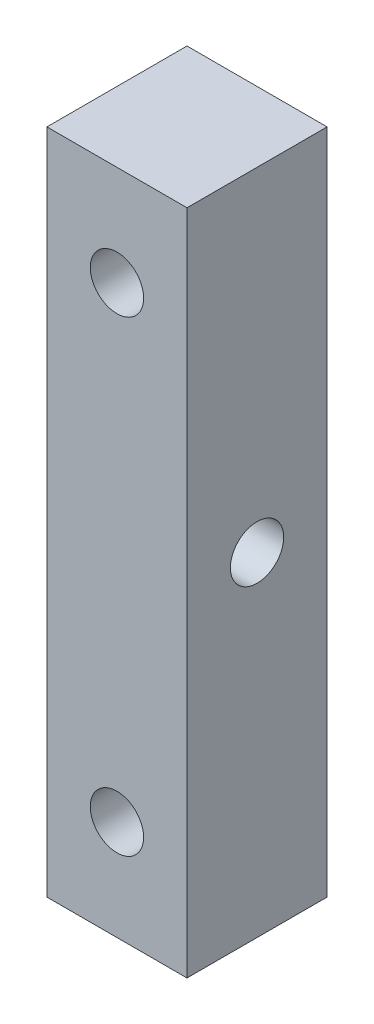
ISO-10303-21;
HEADER;
FILE_DESCRIPTION(('STEP AP214'),'2;1');
FILE_NAME('part.step','',(''),(''),'','','');
FILE_SCHEMA(('AUTOMOTIVE_DESIGN { 1 0 10303 214 1 1 1 1 }'));
ENDSEC;
DATA;
#1=APPLICATION_CONTEXT('core data for automotive mechanical design processes');
#2=APPLICATION_PROTOCOL_DEFINITION('international standard','automotive_design',2000,#1);
#3=PRODUCT_CONTEXT('',#1,'mechanical');
#4=PRODUCT('Part','Part','',(#3));
#5=PRODUCT_RELATED_PRODUCT_CATEGORY('part','',(#4));
#6=PRODUCT_DEFINITION_FORMATION('','',#4);
#7=PRODUCT_DEFINITION_CONTEXT('part definition',#1,'design');
#8=PRODUCT_DEFINITION('design','',#6,#7);
#9=PRODUCT_DEFINITION_SHAPE('','',#8);
#10=(LENGTH_UNIT() NAMED_UNIT(*) SI_UNIT(.MILLI.,.METRE.));
#11=(NAMED_UNIT(*) PLANE_ANGLE_UNIT() SI_UNIT($,.RADIAN.));
#12=(NAMED_UNIT(*) SI_UNIT($,.STERADIAN.) SOLID_ANGLE_UNIT());
#13=UNCERTAINTY_MEASURE_WITH_UNIT(LENGTH_MEASURE(1.E-05),#10,'distance_accuracy_value','');
#14=(GEOMETRIC_REPRESENTATION_CONTEXT(3) GLOBAL_UNCERTAINTY_ASSIGNED_CONTEXT((#13)) GLOBAL_UNIT_ASSIGNED_CONTEXT((#10,
#11,#12)) REPRESENTATION_CONTEXT('',''));
#15=CARTESIAN_POINT('',(0.,0.,0.));
#16=DIRECTION('',(0.,0.,1.));
#17=DIRECTION('',(1.,0.,0.));
#18=AXIS2_PLACEMENT_3D('',#15,#16,#17);
#19=CARTESIAN_POINT('',(10.5,100.,10.5));
#20=DIRECTION('',(-1.,0.,0.));
#21=DIRECTION('',(0.,0.,1.));
#22=AXIS2_PLACEMENT_3D('',#19,#20,#21);
#23=PLANE('',#22);
#24=CARTESIAN_POINT('',(10.5,50.,0.));
#25=DIRECTION('',(1.,0.,0.));
#26=DIRECTION('',(0.,0.,-1.));
#27=AXIS2_PLACEMENT_3D('',#24,#25,#26);
#28=CIRCLE('',#27,4.);
#29=CARTESIAN_POINT('',(10.5,50.,-4.));
#30=VERTEX_POINT('',#29);
#31=EDGE_CURVE('E143',#30,#30,#28,.T.);
#32=ORIENTED_EDGE('',*,*,#31,.F.);
#33=EDGE_LOOP('',(#32));
#34=FACE_BOUND('',#33,.T.);
#35=DIRECTION('',(0.,0.,-1.));
#36=VECTOR('',#35,1.);
#37=CARTESIAN_POINT('',(10.5,0.,10.5));
#38=LINE('',#37,#36);
#39=CARTESIAN_POINT('',(10.5,0.,10.5));
#40=VERTEX_POINT('',#39);
#41=CARTESIAN_POINT('',(10.5,0.,-10.5));
#42=VERTEX_POINT('',#41);
#43=EDGE_CURVE('E106',#40,#42,#38,.T.);
#44=ORIENTED_EDGE('',*,*,#43,.T.);
#45=DIRECTION('',(0.,-1.,0.));
#46=VECTOR('',#45,1.);
#47=CARTESIAN_POINT('',(10.5,100.,-10.5));
#48=LINE('',#47,#46);
#49=CARTESIAN_POINT('',(10.5,100.,-10.5));
#50=VERTEX_POINT('',#49);
#51=EDGE_CURVE('E11',#50,#42,#48,.T.);
#52=ORIENTED_EDGE('',*,*,#51,.F.);
#53=DIRECTION('',(0.,0.,-1.));
#54=VECTOR('',#53,1.);
#55=CARTESIAN_POINT('',(10.5,100.,10.5));
#56=LINE('',#55,#54);
#57=CARTESIAN_POINT('',(10.5,100.,10.5));
#58=VERTEX_POINT('',#57);
#59=EDGE_CURVE('E90',#58,#50,#56,.T.);
#60=ORIENTED_EDGE('',*,*,#59,.F.);
#61=DIRECTION('',(0.,-1.,0.));
#62=VECTOR('',#61,1.);
#63=CARTESIAN_POINT('',(10.5,100.,10.5));
#64=LINE('',#63,#62);
#65=EDGE_CURVE('E102',#58,#40,#64,.T.);
#66=ORIENTED_EDGE('',*,*,#65,.T.);
#67=EDGE_LOOP('',(#44,#52,#60,#66));
#68=FACE_BOUND('',#67,.T.);
#69=ADVANCED_FACE('F38',(#34,#68),#23,.F.);
#70=CARTESIAN_POINT('',(-10.5,100.,-10.5));
#71=DIRECTION('',(0.,0.,1.));
#72=DIRECTION('',(1.,0.,0.));
#73=AXIS2_PLACEMENT_3D('',#70,#71,#72);
#74=PLANE('',#73);
#75=CARTESIAN_POINT('',(0.,85.,-10.5));
#76=DIRECTION('',(0.,0.,1.));
#77=DIRECTION('',(1.,0.,0.));
#78=AXIS2_PLACEMENT_3D('',#75,#76,#77);
#79=CIRCLE('',#78,4.);
#80=CARTESIAN_POINT('',(4.,85.,-10.5));
#81=VERTEX_POINT('',#80);
#82=EDGE_CURVE('E110',#81,#81,#79,.T.);
#83=ORIENTED_EDGE('',*,*,#82,.T.);
#84=EDGE_LOOP('',(#83));
#85=FACE_BOUND('',#84,.T.);
#86=CARTESIAN_POINT('',(0.,15.,-10.5));
#87=DIRECTION('',(0.,0.,1.));
#88=DIRECTION('',(1.,0.,0.));
#89=AXIS2_PLACEMENT_3D('',#86,#87,#88);
#90=CIRCLE('',#89,4.);
#91=CARTESIAN_POINT('',(4.,15.,-10.5));
#92=VERTEX_POINT('',#91);
#93=EDGE_CURVE('E133',#92,#92,#90,.T.);
#94=ORIENTED_EDGE('',*,*,#93,.T.);
#95=EDGE_LOOP('',(#94));
#96=FACE_BOUND('',#95,.T.);
#97=DIRECTION('',(-1.,0.,0.));
#98=VECTOR('',#97,1.);
#99=CARTESIAN_POINT('',(-10.5,0.,-10.5));
#100=LINE('',#99,#98);
#101=CARTESIAN_POINT('',(-10.5,0.,-10.5));
#102=VERTEX_POINT('',#101);
#103=EDGE_CURVE('E95',#42,#102,#100,.T.);
#104=ORIENTED_EDGE('',*,*,#103,.T.);
#105=DIRECTION('',(0.,-1.,0.));
#106=VECTOR('',#105,1.);
#107=CARTESIAN_POINT('',(-10.5,100.,-10.5));
#108=LINE('',#107,#106);
#109=CARTESIAN_POINT('',(-10.5,100.,-10.5));
#110=VERTEX_POINT('',#109);
#111=EDGE_CURVE('E47',#110,#102,#108,.T.);
#112=ORIENTED_EDGE('',*,*,#111,.F.);
#113=DIRECTION('',(-1.,0.,0.));
#114=VECTOR('',#113,1.);
#115=CARTESIAN_POINT('',(-10.5,100.,-10.5));
#116=LINE('',#115,#114);
#117=EDGE_CURVE('E85',#50,#110,#116,.T.);
#118=ORIENTED_EDGE('',*,*,#117,.F.);
#119=ORIENTED_EDGE('',*,*,#51,.T.);
#120=EDGE_LOOP('',(#104,#112,#118,#119));
#121=FACE_BOUND('',#120,.T.);
#122=ADVANCED_FACE('F94',(#85,#96,#121),#74,.F.);
#123=CARTESIAN_POINT('',(-10.5,100.,10.5));
#124=DIRECTION('',(1.,0.,0.));
#125=DIRECTION('',(0.,0.,-1.));
#126=AXIS2_PLACEMENT_3D('',#123,#124,#125);
#127=PLANE('',#126);
#128=CARTESIAN_POINT('',(-10.5,50.,0.));
#129=DIRECTION('',(1.,0.,0.));
#130=DIRECTION('',(0.,0.,-1.));
#131=AXIS2_PLACEMENT_3D('',#128,#129,#130);
#132=CIRCLE('',#131,4.);
#133=CARTESIAN_POINT('',(-10.5,50.,-4.));
#134=VERTEX_POINT('',#133);
#135=EDGE_CURVE('E134',#134,#134,#132,.T.);
#136=ORIENTED_EDGE('',*,*,#135,.T.);
#137=EDGE_LOOP('',(#136));
#138=FACE_BOUND('',#137,.T.);
#139=DIRECTION('',(0.,0.,1.));
#140=VECTOR('',#139,1.);
#141=CARTESIAN_POINT('',(-10.5,0.,10.5));
#142=LINE('',#141,#140);
#143=CARTESIAN_POINT('',(-10.5,0.,10.5));
#144=VERTEX_POINT('',#143);
#145=EDGE_CURVE('E72',#102,#144,#142,.T.);
#146=ORIENTED_EDGE('',*,*,#145,.T.);
#147=DIRECTION('',(0.,-1.,0.));
#148=VECTOR('',#147,1.);
#149=CARTESIAN_POINT('',(-10.5,100.,10.5));
#150=LINE('',#149,#148);
#151=CARTESIAN_POINT('',(-10.5,100.,10.5));
#152=VERTEX_POINT('',#151);
#153=EDGE_CURVE('E97',#152,#144,#150,.T.);
#154=ORIENTED_EDGE('',*,*,#153,.F.);
#155=DIRECTION('',(0.,0.,1.));
#156=VECTOR('',#155,1.);
#157=CARTESIAN_POINT('',(-10.5,100.,10.5));
#158=LINE('',#157,#156);
#159=EDGE_CURVE('E88',#110,#152,#158,.T.);
#160=ORIENTED_EDGE('',*,*,#159,.F.);
#161=ORIENTED_EDGE('',*,*,#111,.T.);
#162=EDGE_LOOP('',(#146,#154,#160,#161));
#163=FACE_BOUND('',#162,.T.);
#164=ADVANCED_FACE('F98',(#138,#163),#127,.F.);
#165=CARTESIAN_POINT('',(-10.5,100.,10.5));
#166=DIRECTION('',(0.,0.,-1.));
#167=DIRECTION('',(-1.,0.,0.));
#168=AXIS2_PLACEMENT_3D('',#165,#166,#167);
#169=PLANE('',#168);
#170=CARTESIAN_POINT('',(0.,85.,10.5));
#171=DIRECTION('',(0.,0.,1.));
#172=DIRECTION('',(1.,0.,0.));
#173=AXIS2_PLACEMENT_3D('',#170,#171,#172);
#174=CIRCLE('',#173,4.);
#175=CARTESIAN_POINT('',(4.,85.,10.5));
#176=VERTEX_POINT('',#175);
#177=EDGE_CURVE('E137',#176,#176,#174,.T.);
#178=ORIENTED_EDGE('',*,*,#177,.F.);
#179=EDGE_LOOP('',(#178));
#180=FACE_BOUND('',#179,.T.);
#181=CARTESIAN_POINT('',(0.,15.,10.5));
#182=DIRECTION('',(0.,0.,1.));
#183=DIRECTION('',(1.,0.,0.));
#184=AXIS2_PLACEMENT_3D('',#181,#182,#183);
#185=CIRCLE('',#184,4.);
#186=CARTESIAN_POINT('',(4.,15.,10.5));
#187=VERTEX_POINT('',#186);
#188=EDGE_CURVE('E129',#187,#187,#185,.T.);
#189=ORIENTED_EDGE('',*,*,#188,.F.);
#190=EDGE_LOOP('',(#189));
#191=FACE_BOUND('',#190,.T.);
#192=DIRECTION('',(1.,0.,0.));
#193=VECTOR('',#192,1.);
#194=CARTESIAN_POINT('',(-10.5,0.,10.5));
#195=LINE('',#194,#193);
#196=EDGE_CURVE('E78',#144,#40,#195,.T.);
#197=ORIENTED_EDGE('',*,*,#196,.T.);
#198=ORIENTED_EDGE('',*,*,#65,.F.);
#199=DIRECTION('',(1.,0.,0.));
#200=VECTOR('',#199,1.);
#201=CARTESIAN_POINT('',(-10.5,100.,10.5));
#202=LINE('',#201,#200);
#203=EDGE_CURVE('E55',#152,#58,#202,.T.);
#204=ORIENTED_EDGE('',*,*,#203,.F.);
#205=ORIENTED_EDGE('',*,*,#153,.T.);
#206=EDGE_LOOP('',(#197,#198,#204,#205));
#207=FACE_BOUND('',#206,.T.);
#208=ADVANCED_FACE('F121',(#180,#191,#207),#169,.F.);
#209=CARTESIAN_POINT('',(0.,100.,0.));
#210=DIRECTION('',(0.,-1.,0.));
#211=DIRECTION('',(0.,0.,-1.));
#212=AXIS2_PLACEMENT_3D('',#209,#210,#211);
#213=PLANE('',#212);
#214=ORIENTED_EDGE('',*,*,#59,.T.);
#215=ORIENTED_EDGE('',*,*,#117,.T.);
#216=ORIENTED_EDGE('',*,*,#159,.T.);
#217=ORIENTED_EDGE('',*,*,#203,.T.);
#218=EDGE_LOOP('',(#214,#215,#216,#217));
#219=FACE_BOUND('',#218,.T.);
#220=ADVANCED_FACE('F86',(#219),#213,.F.);
#221=CARTESIAN_POINT('',(0.,0.,0.));
#222=DIRECTION('',(0.,-1.,0.));
#223=DIRECTION('',(0.,0.,-1.));
#224=AXIS2_PLACEMENT_3D('',#221,#222,#223);
#225=PLANE('',#224);
#226=ORIENTED_EDGE('',*,*,#43,.F.);
#227=ORIENTED_EDGE('',*,*,#196,.F.);
#228=ORIENTED_EDGE('',*,*,#145,.F.);
#229=ORIENTED_EDGE('',*,*,#103,.F.);
#230=EDGE_LOOP('',(#226,#227,#228,#229));
#231=FACE_BOUND('',#230,.T.);
#232=ADVANCED_FACE('F124',(#231),#225,.T.);
#233=CARTESIAN_POINT('',(0.,15.,-10.5));
#234=DIRECTION('',(0.,0.,1.));
#235=DIRECTION('',(1.,0.,0.));
#236=AXIS2_PLACEMENT_3D('',#233,#234,#235);
#237=CYLINDRICAL_SURFACE('',#236,4.);
#238=CARTESIAN_POINT('',(4.,15.,-10.5));
#239=CARTESIAN_POINT('',(4.,15.,-10.28125));
#240=CARTESIAN_POINT('',(4.,15.,-10.0625));
#241=CARTESIAN_POINT('',(4.,15.,-9.625));
#242=CARTESIAN_POINT('',(4.,15.,-9.40625));
#243=CARTESIAN_POINT('',(4.,15.,-8.96875));
#244=CARTESIAN_POINT('',(4.,15.,-8.75));
#245=CARTESIAN_POINT('',(4.,15.,-8.3125));
#246=CARTESIAN_POINT('',(4.,15.,-8.09375));
#247=CARTESIAN_POINT('',(4.,15.,-7.65625));
#248=CARTESIAN_POINT('',(4.,15.,-7.4375));
#249=CARTESIAN_POINT('',(4.,15.,-7.));
#250=CARTESIAN_POINT('',(4.,15.,-6.78125));
#251=CARTESIAN_POINT('',(4.,15.,-6.34375));
#252=CARTESIAN_POINT('',(4.,15.,-6.125));
#253=CARTESIAN_POINT('',(4.,15.,-5.6875));
#254=CARTESIAN_POINT('',(4.,15.,-5.46875));
#255=CARTESIAN_POINT('',(4.,15.,-5.03125));
#256=CARTESIAN_POINT('',(4.,15.,-4.8125));
#257=CARTESIAN_POINT('',(4.,15.,-4.375));
#258=CARTESIAN_POINT('',(4.,15.,-4.15625));
#259=CARTESIAN_POINT('',(4.,15.,-3.71875));
#260=CARTESIAN_POINT('',(4.,15.,-3.5));
#261=CARTESIAN_POINT('',(4.,15.,-3.0625));
#262=CARTESIAN_POINT('',(4.,15.,-2.84375));
#263=CARTESIAN_POINT('',(4.,15.,-2.40625));
#264=CARTESIAN_POINT('',(4.,15.,-2.1875));
#265=CARTESIAN_POINT('',(4.,15.,-1.75));
#266=CARTESIAN_POINT('',(4.,15.,-1.53125));
#267=CARTESIAN_POINT('',(4.,15.,-1.09375));
#268=CARTESIAN_POINT('',(4.,15.,-0.874999999999999));
#269=CARTESIAN_POINT('',(4.,15.,-0.437499999999999));
#270=CARTESIAN_POINT('',(4.,15.,-0.218749999999998));
#271=CARTESIAN_POINT('',(4.,15.,0.218750000000002));
#272=CARTESIAN_POINT('',(4.,15.,0.437500000000002));
#273=CARTESIAN_POINT('',(4.,15.,0.875000000000003));
#274=CARTESIAN_POINT('',(4.,15.,1.09375));
#275=CARTESIAN_POINT('',(4.,15.,1.53125));
#276=CARTESIAN_POINT('',(4.,15.,1.75));
#277=CARTESIAN_POINT('',(4.,15.,2.1875));
#278=CARTESIAN_POINT('',(4.,15.,2.40625));
#279=CARTESIAN_POINT('',(4.,15.,2.84375));
#280=CARTESIAN_POINT('',(4.,15.,3.0625));
#281=CARTESIAN_POINT('',(4.,15.,3.5));
#282=CARTESIAN_POINT('',(4.,15.,3.71875));
#283=CARTESIAN_POINT('',(4.,15.,4.15625));
#284=CARTESIAN_POINT('',(4.,15.,4.375));
#285=CARTESIAN_POINT('',(4.,15.,4.8125));
#286=CARTESIAN_POINT('',(4.,15.,5.03125));
#287=CARTESIAN_POINT('',(4.,15.,5.46875));
#288=CARTESIAN_POINT('',(4.,15.,5.6875));
#289=CARTESIAN_POINT('',(4.,15.,6.125));
#290=CARTESIAN_POINT('',(4.,15.,6.34375));
#291=CARTESIAN_POINT('',(4.,15.,6.78125));
#292=CARTESIAN_POINT('',(4.,15.,7.));
#293=CARTESIAN_POINT('',(4.,15.,7.4375));
#294=CARTESIAN_POINT('',(4.,15.,7.65625));
#295=CARTESIAN_POINT('',(4.,15.,8.09375));
#296=CARTESIAN_POINT('',(4.,15.,8.3125));
#297=CARTESIAN_POINT('',(4.,15.,8.75));
#298=CARTESIAN_POINT('',(4.,15.,8.96875));
#299=CARTESIAN_POINT('',(4.,15.,9.40625));
#300=CARTESIAN_POINT('',(4.,15.,9.625));
#301=CARTESIAN_POINT('',(4.,15.,10.0625));
#302=CARTESIAN_POINT('',(4.,15.,10.28125));
#303=CARTESIAN_POINT('',(4.,15.,10.5));
#304=B_SPLINE_CURVE_WITH_KNOTS('',3,(#238,#239,#240,#241,#242,#243,#244,#245,#246,#247,#248,
#249,#250,#251,#252,#253,#254,#255,#256,#257,#258,#259,#260,#261,#262,#263,#264,#265,#266,#267,
#268,#269,#270,#271,#272,#273,#274,#275,#276,#277,#278,#279,#280,#281,#282,#283,#284,#285,#286,
#287,#288,#289,#290,#291,#292,#293,#294,#295,#296,#297,#298,#299,#300,#301,#302,#303),
.UNSPECIFIED.,.F.,.F.,(4,2,2,2,2,2,2,2,2,2,2,2,2,2,2,2,2,2,2,2,2,2,2,2,2,2,2,2,2,2,2,2,4),(0.,
0.656249999999999,1.3125,1.96875,2.625,3.28125,3.9375,4.59375,5.25,5.90625,6.5625,7.21875,7.875,
8.53125,9.1875,9.84375,10.5,11.15625,11.8125,12.46875,13.125,13.78125,14.4375,15.09375,15.75,
16.40625,17.0625,17.71875,18.375,19.03125,19.6875,20.34375,21.),.UNSPECIFIED.);
#305=EDGE_CURVE('BSEAM175',#92,#187,#304,.T.);
#306=ORIENTED_EDGE('',*,*,#93,.F.);
#307=ORIENTED_EDGE('',*,*,#188,.T.);
#308=ORIENTED_EDGE('',*,*,#305,.T.);
#309=ORIENTED_EDGE('',*,*,#305,.F.);
#310=EDGE_LOOP('',(#306,#308,#307,#309));
#311=FACE_BOUND('',#310,.T.);
#312=ADVANCED_FACE('F175',(#311),#237,.F.);
#313=CARTESIAN_POINT('',(0.,85.,-10.5));
#314=DIRECTION('',(0.,0.,1.));
#315=DIRECTION('',(1.,0.,0.));
#316=AXIS2_PLACEMENT_3D('',#313,#314,#315);
#317=CYLINDRICAL_SURFACE('',#316,4.);
#318=CARTESIAN_POINT('',(4.,85.,-10.5));
#319=CARTESIAN_POINT('',(4.,85.,-10.28125));
#320=CARTESIAN_POINT('',(4.,85.,-10.0625));
#321=CARTESIAN_POINT('',(4.,85.,-9.625));
#322=CARTESIAN_POINT('',(4.,85.,-9.40625));
#323=CARTESIAN_POINT('',(4.,85.,-8.96875));
#324=CARTESIAN_POINT('',(4.,85.,-8.75));
#325=CARTESIAN_POINT('',(4.,85.,-8.3125));
#326=CARTESIAN_POINT('',(4.,85.,-8.09375));
#327=CARTESIAN_POINT('',(4.,85.,-7.65625));
#328=CARTESIAN_POINT('',(4.,85.,-7.4375));
#329=CARTESIAN_POINT('',(4.,85.,-7.));
#330=CARTESIAN_POINT('',(4.,85.,-6.78125));
#331=CARTESIAN_POINT('',(4.,85.,-6.34375));
#332=CARTESIAN_POINT('',(4.,85.,-6.125));
#333=CARTESIAN_POINT('',(4.,85.,-5.6875));
#334=CARTESIAN_POINT('',(4.,85.,-5.46875));
#335=CARTESIAN_POINT('',(4.,85.,-5.03125));
#336=CARTESIAN_POINT('',(4.,85.,-4.8125));
#337=CARTESIAN_POINT('',(4.,85.,-4.375));
#338=CARTESIAN_POINT('',(4.,85.,-4.15625));
#339=CARTESIAN_POINT('',(4.,85.,-3.71875));
#340=CARTESIAN_POINT('',(4.,85.,-3.5));
#341=CARTESIAN_POINT('',(4.,85.,-3.0625));
#342=CARTESIAN_POINT('',(4.,85.,-2.84375));
#343=CARTESIAN_POINT('',(4.,85.,-2.40625));
#344=CARTESIAN_POINT('',(4.,85.,-2.1875));
#345=CARTESIAN_POINT('',(4.,85.,-1.75));
#346=CARTESIAN_POINT('',(4.,85.,-1.53125));
#347=CARTESIAN_POINT('',(4.,85.,-1.09375));
#348=CARTESIAN_POINT('',(4.,85.,-0.874999999999999));
#349=CARTESIAN_POINT('',(4.,85.,-0.437499999999999));
#350=CARTESIAN_POINT('',(4.,85.,-0.218749999999998));
#351=CARTESIAN_POINT('',(4.,85.,0.218750000000002));
#352=CARTESIAN_POINT('',(4.,85.,0.437500000000002));
#353=CARTESIAN_POINT('',(4.,85.,0.875000000000003));
#354=CARTESIAN_POINT('',(4.,85.,1.09375));
#355=CARTESIAN_POINT('',(4.,85.,1.53125));
#356=CARTESIAN_POINT('',(4.,85.,1.75));
#357=CARTESIAN_POINT('',(4.,85.,2.1875));
#358=CARTESIAN_POINT('',(4.,85.,2.40625));
#359=CARTESIAN_POINT('',(4.,85.,2.84375));
#360=CARTESIAN_POINT('',(4.,85.,3.0625));
#361=CARTESIAN_POINT('',(4.,85.,3.5));
#362=CARTESIAN_POINT('',(4.,85.,3.71875));
#363=CARTESIAN_POINT('',(4.,85.,4.15625));
#364=CARTESIAN_POINT('',(4.,85.,4.375));
#365=CARTESIAN_POINT('',(4.,85.,4.8125));
#366=CARTESIAN_POINT('',(4.,85.,5.03125));
#367=CARTESIAN_POINT('',(4.,85.,5.46875));
#368=CARTESIAN_POINT('',(4.,85.,5.6875));
#369=CARTESIAN_POINT('',(4.,85.,6.125));
#370=CARTESIAN_POINT('',(4.,85.,6.34375));
#371=CARTESIAN_POINT('',(4.,85.,6.78125));
#372=CARTESIAN_POINT('',(4.,85.,7.));
#373=CARTESIAN_POINT('',(4.,85.,7.4375));
#374=CARTESIAN_POINT('',(4.,85.,7.65625));
#375=CARTESIAN_POINT('',(4.,85.,8.09375));
#376=CARTESIAN_POINT('',(4.,85.,8.3125));
#377=CARTESIAN_POINT('',(4.,85.,8.75));
#378=CARTESIAN_POINT('',(4.,85.,8.96875));
#379=CARTESIAN_POINT('',(4.,85.,9.40625));
#380=CARTESIAN_POINT('',(4.,85.,9.625));
#381=CARTESIAN_POINT('',(4.,85.,10.0625));
#382=CARTESIAN_POINT('',(4.,85.,10.28125));
#383=CARTESIAN_POINT('',(4.,85.,10.5));
#384=B_SPLINE_CURVE_WITH_KNOTS('',3,(#318,#319,#320,#321,#322,#323,#324,#325,#326,#327,#328,
#329,#330,#331,#332,#333,#334,#335,#336,#337,#338,#339,#340,#341,#342,#343,#344,#345,#346,#347,
#348,#349,#350,#351,#352,#353,#354,#355,#356,#357,#358,#359,#360,#361,#362,#363,#364,#365,#366,
#367,#368,#369,#370,#371,#372,#373,#374,#375,#376,#377,#378,#379,#380,#381,#382,#383),
.UNSPECIFIED.,.F.,.F.,(4,2,2,2,2,2,2,2,2,2,2,2,2,2,2,2,2,2,2,2,2,2,2,2,2,2,2,2,2,2,2,2,4),(0.,
0.656249999999999,1.3125,1.96875,2.625,3.28125,3.9375,4.59375,5.25,5.90625,6.5625,7.21875,7.875,
8.53125,9.1875,9.84375,10.5,11.15625,11.8125,12.46875,13.125,13.78125,14.4375,15.09375,15.75,
16.40625,17.0625,17.71875,18.375,19.03125,19.6875,20.34375,21.),.UNSPECIFIED.);
#385=EDGE_CURVE('BSEAM155',#81,#176,#384,.T.);
#386=ORIENTED_EDGE('',*,*,#82,.F.);
#387=ORIENTED_EDGE('',*,*,#177,.T.);
#388=ORIENTED_EDGE('',*,*,#385,.T.);
#389=ORIENTED_EDGE('',*,*,#385,.F.);
#390=EDGE_LOOP('',(#386,#388,#387,#389));
#391=FACE_BOUND('',#390,.T.);
#392=ADVANCED_FACE('F155',(#391),#317,.F.);
#393=CARTESIAN_POINT('',(-10.5,50.,0.));
#394=DIRECTION('',(1.,0.,0.));
#395=DIRECTION('',(0.,0.,-1.));
#396=AXIS2_PLACEMENT_3D('',#393,#394,#395);
#397=CYLINDRICAL_SURFACE('',#396,4.);
#398=CARTESIAN_POINT('',(-10.5,50.,-4.));
#399=CARTESIAN_POINT('',(-10.28125,50.,-4.));
#400=CARTESIAN_POINT('',(-10.0625,50.,-4.));
#401=CARTESIAN_POINT('',(-9.625,50.,-4.));
#402=CARTESIAN_POINT('',(-9.40625,50.,-4.));
#403=CARTESIAN_POINT('',(-8.96875,50.,-4.));
#404=CARTESIAN_POINT('',(-8.75,50.,-4.));
#405=CARTESIAN_POINT('',(-8.3125,50.,-4.));
#406=CARTESIAN_POINT('',(-8.09375,50.,-4.));
#407=CARTESIAN_POINT('',(-7.65625,50.,-4.));
#408=CARTESIAN_POINT('',(-7.4375,50.,-4.));
#409=CARTESIAN_POINT('',(-7.,50.,-4.));
#410=CARTESIAN_POINT('',(-6.78125,50.,-4.));
#411=CARTESIAN_POINT('',(-6.34375,50.,-4.));
#412=CARTESIAN_POINT('',(-6.125,50.,-4.));
#413=CARTESIAN_POINT('',(-5.6875,50.,-4.));
#414=CARTESIAN_POINT('',(-5.46875,50.,-4.));
#415=CARTESIAN_POINT('',(-5.03125,50.,-4.));
#416=CARTESIAN_POINT('',(-4.8125,50.,-4.));
#417=CARTESIAN_POINT('',(-4.375,50.,-4.));
#418=CARTESIAN_POINT('',(-4.15625,50.,-4.));
#419=CARTESIAN_POINT('',(-3.71875,50.,-4.));
#420=CARTESIAN_POINT('',(-3.5,50.,-4.));
#421=CARTESIAN_POINT('',(-3.0625,50.,-4.));
#422=CARTESIAN_POINT('',(-2.84375,50.,-4.));
#423=CARTESIAN_POINT('',(-2.40625,50.,-4.));
#424=CARTESIAN_POINT('',(-2.1875,50.,-4.));
#425=CARTESIAN_POINT('',(-1.75,50.,-4.));
#426=CARTESIAN_POINT('',(-1.53125,50.,-4.));
#427=CARTESIAN_POINT('',(-1.09375,50.,-4.));
#428=CARTESIAN_POINT('',(-0.874999999999999,50.,-4.));
#429=CARTESIAN_POINT('',(-0.437499999999999,50.,-4.));
#430=CARTESIAN_POINT('',(-0.218749999999998,50.,-4.));
#431=CARTESIAN_POINT('',(0.218750000000002,50.,-4.));
#432=CARTESIAN_POINT('',(0.437500000000002,50.,-4.));
#433=CARTESIAN_POINT('',(0.875000000000003,50.,-4.));
#434=CARTESIAN_POINT('',(1.09375,50.,-4.));
#435=CARTESIAN_POINT('',(1.53125,50.,-4.));
#436=CARTESIAN_POINT('',(1.75,50.,-4.));
#437=CARTESIAN_POINT('',(2.1875,50.,-4.));
#438=CARTESIAN_POINT('',(2.40625,50.,-4.));
#439=CARTESIAN_POINT('',(2.84375,50.,-4.));
#440=CARTESIAN_POINT('',(3.0625,50.,-4.));
#441=CARTESIAN_POINT('',(3.5,50.,-4.));
#442=CARTESIAN_POINT('',(3.71875,50.,-4.));
#443=CARTESIAN_POINT('',(4.15625,50.,-4.));
#444=CARTESIAN_POINT('',(4.375,50.,-4.));
#445=CARTESIAN_POINT('',(4.8125,50.,-4.));
#446=CARTESIAN_POINT('',(5.03125,50.,-4.));
#447=CARTESIAN_POINT('',(5.46875,50.,-4.));
#448=CARTESIAN_POINT('',(5.6875,50.,-4.));
#449=CARTESIAN_POINT('',(6.125,50.,-4.));
#450=CARTESIAN_POINT('',(6.34375,50.,-4.));
#451=CARTESIAN_POINT('',(6.78125,50.,-4.));
#452=CARTESIAN_POINT('',(7.,50.,-4.));
#453=CARTESIAN_POINT('',(7.4375,50.,-4.));
#454=CARTESIAN_POINT('',(7.65625,50.,-4.));
#455=CARTESIAN_POINT('',(8.09375,50.,-4.));
#456=CARTESIAN_POINT('',(8.3125,50.,-4.));
#457=CARTESIAN_POINT('',(8.75,50.,-4.));
#458=CARTESIAN_POINT('',(8.96875,50.,-4.));
#459=CARTESIAN_POINT('',(9.40625,50.,-4.));
#460=CARTESIAN_POINT('',(9.625,50.,-4.));
#461=CARTESIAN_POINT('',(10.0625,50.,-4.));
#462=CARTESIAN_POINT('',(10.28125,50.,-4.));
#463=CARTESIAN_POINT('',(10.5,50.,-4.));
#464=B_SPLINE_CURVE_WITH_KNOTS('',3,(#398,#399,#400,#401,#402,#403,#404,#405,#406,#407,#408,
#409,#410,#411,#412,#413,#414,#415,#416,#417,#418,#419,#420,#421,#422,#423,#424,#425,#426,#427,
#428,#429,#430,#431,#432,#433,#434,#435,#436,#437,#438,#439,#440,#441,#442,#443,#444,#445,#446,
#447,#448,#449,#450,#451,#452,#453,#454,#455,#456,#457,#458,#459,#460,#461,#462,#463),
.UNSPECIFIED.,.F.,.F.,(4,2,2,2,2,2,2,2,2,2,2,2,2,2,2,2,2,2,2,2,2,2,2,2,2,2,2,2,2,2,2,2,4),(0.,
0.656249999999999,1.3125,1.96875,2.625,3.28125,3.9375,4.59375,5.25,5.90625,6.5625,7.21875,7.875,
8.53125,9.1875,9.84375,10.5,11.15625,11.8125,12.46875,13.125,13.78125,14.4375,15.09375,15.75,
16.40625,17.0625,17.71875,18.375,19.03125,19.6875,20.34375,21.),.UNSPECIFIED.);
#465=EDGE_CURVE('BSEAM152',#134,#30,#464,.T.);
#466=ORIENTED_EDGE('',*,*,#135,.F.);
#467=ORIENTED_EDGE('',*,*,#31,.T.);
#468=ORIENTED_EDGE('',*,*,#465,.T.);
#469=ORIENTED_EDGE('',*,*,#465,.F.);
#470=EDGE_LOOP('',(#466,#468,#467,#469));
#471=FACE_BOUND('',#470,.T.);
#472=ADVANCED_FACE('F152',(#471),#397,.F.);
#473=CLOSED_SHELL('',(#69,#122,#164,#208,#220,#232,#312,#392,#472));
#474=MANIFOLD_SOLID_BREP('B2',#473);
#475=ADVANCED_BREP_SHAPE_REPRESENTATION('',(#18,#474),#14);
#476=SHAPE_DEFINITION_REPRESENTATION(#9,#475);
ENDSEC;
END-ISO-10303-21;
